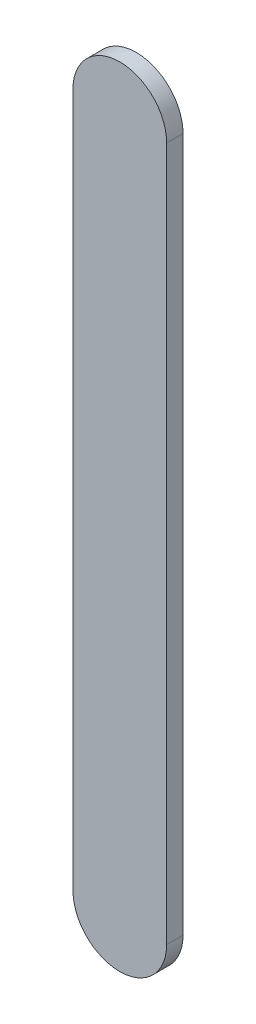
ISO-10303-21;
HEADER;
FILE_DESCRIPTION(('STEP AP214'),'2;1');
FILE_NAME('part.step','',(''),(''),'','','');
FILE_SCHEMA(('AUTOMOTIVE_DESIGN { 1 0 10303 214 1 1 1 1 }'));
ENDSEC;
DATA;
#1=APPLICATION_CONTEXT('core data for automotive mechanical design processes');
#2=APPLICATION_PROTOCOL_DEFINITION('international standard','automotive_design',2000,#1);
#3=PRODUCT_CONTEXT('',#1,'mechanical');
#4=PRODUCT('Part','Part','',(#3));
#5=PRODUCT_RELATED_PRODUCT_CATEGORY('part','',(#4));
#6=PRODUCT_DEFINITION_FORMATION('','',#4);
#7=PRODUCT_DEFINITION_CONTEXT('part definition',#1,'design');
#8=PRODUCT_DEFINITION('design','',#6,#7);
#9=PRODUCT_DEFINITION_SHAPE('','',#8);
#10=(LENGTH_UNIT() NAMED_UNIT(*) SI_UNIT(.MILLI.,.METRE.));
#11=(NAMED_UNIT(*) PLANE_ANGLE_UNIT() SI_UNIT($,.RADIAN.));
#12=(NAMED_UNIT(*) SI_UNIT($,.STERADIAN.) SOLID_ANGLE_UNIT());
#13=UNCERTAINTY_MEASURE_WITH_UNIT(LENGTH_MEASURE(1.E-05),#10,'distance_accuracy_value','');
#14=(GEOMETRIC_REPRESENTATION_CONTEXT(3) GLOBAL_UNCERTAINTY_ASSIGNED_CONTEXT((#13)) GLOBAL_UNIT_ASSIGNED_CONTEXT((#10,
#11,#12)) REPRESENTATION_CONTEXT('',''));
#15=CARTESIAN_POINT('',(0.,0.,0.));
#16=DIRECTION('',(0.,0.,1.));
#17=DIRECTION('',(1.,0.,0.));
#18=AXIS2_PLACEMENT_3D('',#15,#16,#17);
#19=CARTESIAN_POINT('',(93.45,-130.117767,1.635));
#20=DIRECTION('',(0.,0.,1.));
#21=DIRECTION('',(1.,0.,0.));
#22=AXIS2_PLACEMENT_3D('',#19,#20,#21);
#23=PLANE('',#22);
#24=DIRECTION('',(0.,-1.,0.));
#25=VECTOR('',#24,1.);
#26=CARTESIAN_POINT('',(93.45,-130.117767,1.635));
#27=LINE('',#26,#25);
#28=CARTESIAN_POINT('',(93.45,-130.117767,1.635));
#29=VERTEX_POINT('',#28);
#30=CARTESIAN_POINT('',(93.45,-131.6,1.635));
#31=VERTEX_POINT('',#30);
#32=EDGE_CURVE('E93',#29,#31,#27,.T.);
#33=ORIENTED_EDGE('',*,*,#32,.T.);
#34=CARTESIAN_POINT('',(93.55,-131.6,1.635));
#35=DIRECTION('',(0.,0.,1.));
#36=DIRECTION('',(-1.,-2.842170943041E-13,0.));
#37=AXIS2_PLACEMENT_3D('',#34,#35,#36);
#38=CIRCLE('',#37,0.1);
#39=CARTESIAN_POINT('',(93.65,-131.6,1.635));
#40=VERTEX_POINT('',#39);
#41=EDGE_CURVE('E71',#31,#40,#38,.T.);
#42=ORIENTED_EDGE('',*,*,#41,.T.);
#43=DIRECTION('',(0.,1.,0.));
#44=VECTOR('',#43,1.);
#45=CARTESIAN_POINT('',(93.65,-131.6,1.635));
#46=LINE('',#45,#44);
#47=CARTESIAN_POINT('',(93.65,-130.117767,1.635));
#48=VERTEX_POINT('',#47);
#49=EDGE_CURVE('E76',#40,#48,#46,.T.);
#50=ORIENTED_EDGE('',*,*,#49,.T.);
#51=CARTESIAN_POINT('',(93.55,-130.117767,1.635));
#52=DIRECTION('',(0.,0.,1.));
#53=DIRECTION('',(1.,2.84217094304E-13,0.));
#54=AXIS2_PLACEMENT_3D('',#51,#52,#53);
#55=CIRCLE('',#54,0.1);
#56=EDGE_CURVE('E11',#48,#29,#55,.T.);
#57=ORIENTED_EDGE('',*,*,#56,.T.);
#58=EDGE_LOOP('',(#33,#42,#50,#57));
#59=FACE_BOUND('',#58,.T.);
#60=ADVANCED_FACE('F17',(#59),#23,.T.);
#61=CARTESIAN_POINT('',(93.45,-130.117767,1.6));
#62=DIRECTION('',(0.,0.,1.));
#63=DIRECTION('',(1.,0.,0.));
#64=AXIS2_PLACEMENT_3D('',#61,#62,#63);
#65=PLANE('',#64);
#66=CARTESIAN_POINT('',(93.55,-130.117767,1.6));
#67=DIRECTION('',(0.,0.,1.));
#68=DIRECTION('',(1.,2.84217094304E-13,0.));
#69=AXIS2_PLACEMENT_3D('',#66,#67,#68);
#70=CIRCLE('',#69,0.1);
#71=CARTESIAN_POINT('',(93.65,-130.117767,1.6));
#72=VERTEX_POINT('',#71);
#73=CARTESIAN_POINT('',(93.45,-130.117767,1.6));
#74=VERTEX_POINT('',#73);
#75=EDGE_CURVE('E25',#72,#74,#70,.T.);
#76=ORIENTED_EDGE('',*,*,#75,.F.);
#77=DIRECTION('',(0.,1.,0.));
#78=VECTOR('',#77,1.);
#79=CARTESIAN_POINT('',(93.65,-131.6,1.6));
#80=LINE('',#79,#78);
#81=CARTESIAN_POINT('',(93.65,-131.6,1.6));
#82=VERTEX_POINT('',#81);
#83=EDGE_CURVE('E60',#82,#72,#80,.T.);
#84=ORIENTED_EDGE('',*,*,#83,.F.);
#85=CARTESIAN_POINT('',(93.55,-131.6,1.6));
#86=DIRECTION('',(0.,0.,1.));
#87=DIRECTION('',(-1.,-2.842170943041E-13,0.));
#88=AXIS2_PLACEMENT_3D('',#85,#86,#87);
#89=CIRCLE('',#88,0.1);
#90=CARTESIAN_POINT('',(93.45,-131.6,1.6));
#91=VERTEX_POINT('',#90);
#92=EDGE_CURVE('E65',#91,#82,#89,.T.);
#93=ORIENTED_EDGE('',*,*,#92,.F.);
#94=DIRECTION('',(0.,-1.,0.));
#95=VECTOR('',#94,1.);
#96=CARTESIAN_POINT('',(93.45,-130.117767,1.6));
#97=LINE('',#96,#95);
#98=EDGE_CURVE('E118',#74,#91,#97,.T.);
#99=ORIENTED_EDGE('',*,*,#98,.F.);
#100=EDGE_LOOP('',(#76,#84,#93,#99));
#101=FACE_BOUND('',#100,.T.);
#102=ADVANCED_FACE('F62',(#101),#65,.F.);
#103=CARTESIAN_POINT('',(93.55,-130.117767,1.6));
#104=DIRECTION('',(0.,0.,-1.));
#105=DIRECTION('',(1.,2.84217094304E-13,0.));
#106=AXIS2_PLACEMENT_3D('',#103,#104,#105);
#107=CYLINDRICAL_SURFACE('',#106,0.1);
#108=ORIENTED_EDGE('',*,*,#75,.T.);
#109=DIRECTION('',(0.,0.,1.));
#110=VECTOR('',#109,1.);
#111=CARTESIAN_POINT('',(93.45,-130.117767,1.6));
#112=LINE('',#111,#110);
#113=EDGE_CURVE('E87',#74,#29,#112,.T.);
#114=ORIENTED_EDGE('',*,*,#113,.T.);
#115=ORIENTED_EDGE('',*,*,#56,.F.);
#116=DIRECTION('',(0.,0.,1.));
#117=VECTOR('',#116,1.);
#118=CARTESIAN_POINT('',(93.65,-130.117767,1.6));
#119=LINE('',#118,#117);
#120=EDGE_CURVE('E70',#72,#48,#119,.T.);
#121=ORIENTED_EDGE('',*,*,#120,.F.);
#122=EDGE_LOOP('',(#108,#114,#115,#121));
#123=FACE_BOUND('',#122,.T.);
#124=ADVANCED_FACE('F110',(#123),#107,.T.);
#125=CARTESIAN_POINT('',(93.65,-131.6,1.6));
#126=DIRECTION('',(-1.,0.,0.));
#127=DIRECTION('',(0.,0.,1.));
#128=AXIS2_PLACEMENT_3D('',#125,#126,#127);
#129=PLANE('',#128);
#130=ORIENTED_EDGE('',*,*,#83,.T.);
#131=ORIENTED_EDGE('',*,*,#120,.T.);
#132=ORIENTED_EDGE('',*,*,#49,.F.);
#133=DIRECTION('',(0.,0.,1.));
#134=VECTOR('',#133,1.);
#135=CARTESIAN_POINT('',(93.65,-131.6,1.6));
#136=LINE('',#135,#134);
#137=EDGE_CURVE('E74',#82,#40,#136,.T.);
#138=ORIENTED_EDGE('',*,*,#137,.F.);
#139=EDGE_LOOP('',(#130,#131,#132,#138));
#140=FACE_BOUND('',#139,.T.);
#141=ADVANCED_FACE('F75',(#140),#129,.F.);
#142=CARTESIAN_POINT('',(93.55,-131.6,1.6));
#143=DIRECTION('',(0.,0.,-1.));
#144=DIRECTION('',(-1.,-2.842170943041E-13,0.));
#145=AXIS2_PLACEMENT_3D('',#142,#143,#144);
#146=CYLINDRICAL_SURFACE('',#145,0.1);
#147=ORIENTED_EDGE('',*,*,#92,.T.);
#148=ORIENTED_EDGE('',*,*,#137,.T.);
#149=ORIENTED_EDGE('',*,*,#41,.F.);
#150=DIRECTION('',(0.,0.,1.));
#151=VECTOR('',#150,1.);
#152=CARTESIAN_POINT('',(93.45,-131.6,1.6));
#153=LINE('',#152,#151);
#154=EDGE_CURVE('E84',#91,#31,#153,.T.);
#155=ORIENTED_EDGE('',*,*,#154,.F.);
#156=EDGE_LOOP('',(#147,#148,#149,#155));
#157=FACE_BOUND('',#156,.T.);
#158=ADVANCED_FACE('F82',(#157),#146,.T.);
#159=CARTESIAN_POINT('',(93.45,-130.117767,1.6));
#160=DIRECTION('',(1.,0.,0.));
#161=DIRECTION('',(0.,1.,0.));
#162=AXIS2_PLACEMENT_3D('',#159,#160,#161);
#163=PLANE('',#162);
#164=ORIENTED_EDGE('',*,*,#98,.T.);
#165=ORIENTED_EDGE('',*,*,#154,.T.);
#166=ORIENTED_EDGE('',*,*,#32,.F.);
#167=ORIENTED_EDGE('',*,*,#113,.F.);
#168=EDGE_LOOP('',(#164,#165,#166,#167));
#169=FACE_BOUND('',#168,.T.);
#170=ADVANCED_FACE('F117',(#169),#163,.F.);
#171=CLOSED_SHELL('',(#60,#102,#124,#141,#158,#170));
#172=MANIFOLD_SOLID_BREP('B1',#171);
#173=ADVANCED_BREP_SHAPE_REPRESENTATION('',(#18,#172),#14);
#174=SHAPE_DEFINITION_REPRESENTATION(#9,#173);
ENDSEC;
END-ISO-10303-21;
